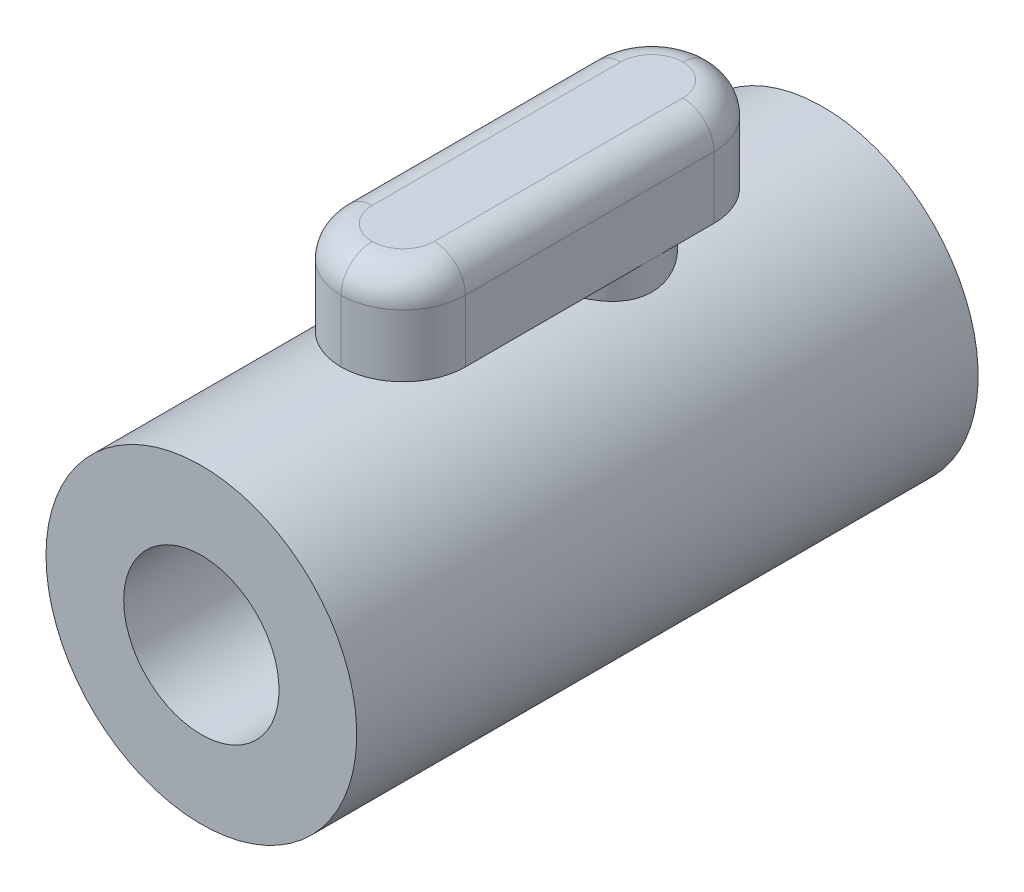
ISO-10303-21;
HEADER;
FILE_DESCRIPTION(('STEP AP214'),'2;1');
FILE_NAME('part.step','',(''),(''),'','','');
FILE_SCHEMA(('AUTOMOTIVE_DESIGN { 1 0 10303 214 1 1 1 1 }'));
ENDSEC;
DATA;
#1=APPLICATION_CONTEXT('core data for automotive mechanical design processes');
#2=APPLICATION_PROTOCOL_DEFINITION('international standard','automotive_design',2000,#1);
#3=PRODUCT_CONTEXT('',#1,'mechanical');
#4=PRODUCT('Part','Part','',(#3));
#5=PRODUCT_RELATED_PRODUCT_CATEGORY('part','',(#4));
#6=PRODUCT_DEFINITION_FORMATION('','',#4);
#7=PRODUCT_DEFINITION_CONTEXT('part definition',#1,'design');
#8=PRODUCT_DEFINITION('design','',#6,#7);
#9=PRODUCT_DEFINITION_SHAPE('','',#8);
#10=(LENGTH_UNIT() NAMED_UNIT(*) SI_UNIT(.MILLI.,.METRE.));
#11=(NAMED_UNIT(*) PLANE_ANGLE_UNIT() SI_UNIT($,.RADIAN.));
#12=(NAMED_UNIT(*) SI_UNIT($,.STERADIAN.) SOLID_ANGLE_UNIT());
#13=UNCERTAINTY_MEASURE_WITH_UNIT(LENGTH_MEASURE(1.E-05),#10,'distance_accuracy_value','');
#14=(GEOMETRIC_REPRESENTATION_CONTEXT(3) GLOBAL_UNCERTAINTY_ASSIGNED_CONTEXT((#13)) GLOBAL_UNIT_ASSIGNED_CONTEXT((#10,
#11,#12)) REPRESENTATION_CONTEXT('',''));
#15=CARTESIAN_POINT('',(0.,0.,0.));
#16=DIRECTION('',(0.,0.,1.));
#17=DIRECTION('',(1.,0.,0.));
#18=AXIS2_PLACEMENT_3D('',#15,#16,#17);
#19=CARTESIAN_POINT('',(0.,-10.002,-15.));
#20=DIRECTION('',(0.,1.,0.));
#21=DIRECTION('',(0.,0.,1.));
#22=AXIS2_PLACEMENT_3D('',#19,#20,#21);
#23=CYLINDRICAL_SURFACE('',#22,4.);
#24=CARTESIAN_POINT('',(0.,10.,-11.));
#25=CARTESIAN_POINT('',(0.107549581345536,9.99999886871264,-11.0000015749329));
#26=CARTESIAN_POINT('',(0.215132147940361,9.99825999367799,-11.0043436710802));
#27=CARTESIAN_POINT('',(0.429535200549548,9.99134740691108,-11.0216733827839));
#28=CARTESIAN_POINT('',(0.536355162703301,9.98617152790588,-11.0346664534026));
#29=CARTESIAN_POINT('',(0.748635856497416,9.97250573560117,-11.0692080345506));
#30=CARTESIAN_POINT('',(0.854093134440869,9.96400865312144,-11.0907750546198));
#31=CARTESIAN_POINT('',(1.0626676111401,9.94393017211574,-11.1422417304368));
#32=CARTESIAN_POINT('',(1.1657838422726,9.932347522545,-11.1721447662553));
#33=CARTESIAN_POINT('',(1.46979509681069,9.89349112162205,-11.273722808716));
#34=CARTESIAN_POINT('',(1.66629107461992,9.86204458846134,-11.3574218190064));
#35=CARTESIAN_POINT('',(2.04217417878102,9.79113035538708,-11.5540462173498));
#36=CARTESIAN_POINT('',(2.22156721456799,9.75166544086262,-11.6669614601149));
#37=CARTESIAN_POINT('',(2.56699339938209,9.66661825353092,-11.9244687545217));
#38=CARTESIAN_POINT('',(2.73212223266508,9.62084608086599,-12.0702127105756));
#39=CARTESIAN_POINT('',(3.03635232313263,9.52921139577231,-12.386800609152));
#40=CARTESIAN_POINT('',(3.17544084661153,9.48334885017047,-12.5576567590165));
#41=CARTESIAN_POINT('',(3.42974847409894,9.39445587657958,-12.9288559685663));
#42=CARTESIAN_POINT('',(3.54362978572887,9.35164233015934,-13.1301729260637));
#43=CARTESIAN_POINT('',(3.73550961465234,9.2766729328807,-13.5510728428009));
#44=CARTESIAN_POINT('',(3.81352517485723,9.24451202207146,-13.7706470677414));
#45=CARTESIAN_POINT('',(3.92779760260541,9.19652715590089,-14.2114246556858));
#46=CARTESIAN_POINT('',(3.96578791979826,9.18002840771385,-14.4321024680881));
#47=CARTESIAN_POINT('',(4.00434593508728,9.16328008038142,-14.8772699996773));
#48=CARTESIAN_POINT('',(4.00493203570086,9.16302251073202,-15.1017577900111));
#49=CARTESIAN_POINT('',(3.9699787321474,9.17821000534301,-15.5315133422232));
#50=CARTESIAN_POINT('',(3.93695062778272,9.19256349925666,-15.7370314287657));
#51=CARTESIAN_POINT('',(3.83989376129508,9.23352375055553,-16.1393191123503));
#52=CARTESIAN_POINT('',(3.77585958980135,9.26013264599921,-16.3360871763063));
#53=CARTESIAN_POINT('',(3.6173894649114,9.32318970221162,-16.7200356722919));
#54=CARTESIAN_POINT('',(3.52235972457939,9.35982758573424,-16.9069384780825));
#55=CARTESIAN_POINT('',(3.30501292151569,9.43876232767927,-17.26283163275));
#56=CARTESIAN_POINT('',(3.1826856102159,9.48106130910412,-17.4318152188131));
#57=CARTESIAN_POINT('',(2.90310119889356,9.57053473488081,-17.760819457596));
#58=CARTESIAN_POINT('',(2.74387492593716,9.61783329953252,-17.9191374588899));
#59=CARTESIAN_POINT('',(2.40062885486449,9.70919649915615,-18.2073689560062));
#60=CARTESIAN_POINT('',(2.21660413066998,9.75326048890393,-18.3372767948212));
#61=CARTESIAN_POINT('',(1.82415530521056,9.83429362529358,-18.5672348948311));
#62=CARTESIAN_POINT('',(1.61532098269266,9.87110540190899,-18.6666445623939));
#63=CARTESIAN_POINT('',(1.18204753096606,9.93229656657448,-18.8283357221563));
#64=CARTESIAN_POINT('',(0.957616393699399,9.95668226924746,-18.8906360751149));
#65=CARTESIAN_POINT('',(0.51379177521559,9.98912279013839,-18.9728965908394));
#66=CARTESIAN_POINT('',(0.29488658797114,9.99805891667034,-18.9951449085071));
#67=CARTESIAN_POINT('',(-0.143690619615706,10.0013695702126,-19.0034262010573));
#68=CARTESIAN_POINT('',(-0.363362426448183,9.99574787164577,-18.9894685630952));
#69=CARTESIAN_POINT('',(-0.786865478243654,9.97115134127512,-18.9274164948959));
#70=CARTESIAN_POINT('',(-0.99096498354976,9.95278782691064,-18.8808840392975));
#71=CARTESIAN_POINT('',(-1.38827085612275,9.90518882810983,-18.757128583381));
#72=CARTESIAN_POINT('',(-1.58147582045412,9.87595194712999,-18.6799016406648));
#73=CARTESIAN_POINT('',(-1.95815757162884,9.80833189541687,-18.4944301206379));
#74=CARTESIAN_POINT('',(-2.14115604549353,9.76969631959847,-18.3853090559053));
#75=CARTESIAN_POINT('',(-2.4868871825104,9.68746729490809,-18.1401193521971));
#76=CARTESIAN_POINT('',(-2.64961168158684,9.64387186219643,-18.0040399141861));
#77=CARTESIAN_POINT('',(-2.96144608598878,9.55290235277181,-17.6982599740674));
#78=CARTESIAN_POINT('',(-3.10894786734725,9.50546882853787,-17.5269329168592));
#79=CARTESIAN_POINT('',(-3.37350239509234,9.4148334583058,-17.1611198341097));
#80=CARTESIAN_POINT('',(-3.4905501236659,9.37163231039242,-16.9666299998006));
#81=CARTESIAN_POINT('',(-3.69161500286277,9.2942859982933,-16.5570766103267));
#82=CARTESIAN_POINT('',(-3.77530118531766,9.26023261821741,-16.3418319997565));
#83=CARTESIAN_POINT('',(-3.90459244315908,9.20647346903737,-15.8985326983872));
#84=CARTESIAN_POINT('',(-3.95022562452798,9.18675711197461,-15.6704875951582));
#85=CARTESIAN_POINT('',(-3.99943122157417,9.16543518780389,-15.225744190156));
#86=CARTESIAN_POINT('',(-4.0057941177721,9.16262842667612,-15.009410298105));
#87=CARTESIAN_POINT('',(-3.98360636538274,9.17229671415009,-14.5789103072789));
#88=CARTESIAN_POINT('',(-3.9550601501471,9.18476982225497,-14.3647439367175));
#89=CARTESIAN_POINT('',(-3.86614256488129,9.2225330048627,-13.9533355391097));
#90=CARTESIAN_POINT('',(-3.80707437387706,9.2472967218297,-13.7557591537789));
#91=CARTESIAN_POINT('',(-3.66001151041638,9.30647993934966,-13.3732430382103));
#92=CARTESIAN_POINT('',(-3.5720088493455,9.34090210615105,-13.1883068148887));
#93=CARTESIAN_POINT('',(-3.36374310804133,9.41797252826471,-12.8247795892905));
#94=CARTESIAN_POINT('',(-3.24192140926543,9.46097893410836,-12.6471581693117));
#95=CARTESIAN_POINT('',(-2.97179350239177,9.54927479921251,-12.3140178573752));
#96=CARTESIAN_POINT('',(-2.82347931168581,9.59456494363941,-12.15850565271));
#97=CARTESIAN_POINT('',(-2.492974124467,9.68587647140965,-11.8635764074694));
#98=CARTESIAN_POINT('',(-2.30921017071955,9.73175488236393,-11.7258566160177));
#99=CARTESIAN_POINT('',(-2.01716584575533,9.7949502762577,-11.5439518910625));
#100=CARTESIAN_POINT('',(-1.91699501972425,9.81509269692655,-11.487392936147));
#101=CARTESIAN_POINT('',(-1.7118011098248,9.85294835133019,-11.3829620045947));
#102=CARTESIAN_POINT('',(-1.60678027559742,9.87066269647665,-11.335086050192));
#103=CARTESIAN_POINT('',(-1.39454646904328,9.9028559935491,-11.249252015315));
#104=CARTESIAN_POINT('',(-1.28740777135872,9.91738778532477,-11.2111298452528));
#105=CARTESIAN_POINT('',(-1.06995577523383,9.94319722915714,-11.1440786522787));
#106=CARTESIAN_POINT('',(-0.959643983352617,9.95447639837582,-11.1151453426501));
#107=CARTESIAN_POINT('',(-0.736945215856834,9.97343330649399,-11.066825163851));
#108=CARTESIAN_POINT('',(-0.62456426359128,9.98112017494336,-11.047414088355));
#109=CARTESIAN_POINT('',(-0.398419132407603,9.99270031578293,-11.0182614293338));
#110=CARTESIAN_POINT('',(-0.284655994966353,9.99659628445551,-11.0085129731657));
#111=CARTESIAN_POINT('',(-0.113830463425493,9.99951445883957,-11.0012141044266));
#112=CARTESIAN_POINT('',(-0.0569198512645302,10.0000005987258,-10.9999991664779));
#113=CARTESIAN_POINT('',(0.,10.,-11.));
#114=B_SPLINE_CURVE_WITH_KNOTS('',3,(#24,#25,#26,#27,#28,#29,#30,#31,#32,#33,#34,#35,#36,#37,
#38,#39,#40,#41,#42,#43,#44,#45,#46,#47,#48,#49,#50,#51,#52,#53,#54,#55,#56,#57,#58,#59,#60,#61,
#62,#63,#64,#65,#66,#67,#68,#69,#70,#71,#72,#73,#74,#75,#76,#77,#78,#79,#80,#81,#82,#83,#84,#85,
#86,#87,#88,#89,#90,#91,#92,#93,#94,#95,#96,#97,#98,#99,#100,#101,#102,#103,#104,#105,#106,#107,
#108,#109,#110,#111,#112,#113),.UNSPECIFIED.,.T.,.F.,(4,2,2,2,2,2,2,2,2,2,2,2,2,2,2,2,2,2,2,2,2,
2,2,2,2,2,2,2,2,2,2,2,2,2,2,2,2,2,2,2,2,2,2,2,4),(0.,0.322603993422155,0.645411604786482,
0.968919914471235,1.29255959093095,1.93701523385824,2.58124739027476,3.25313995292302,
3.92536021760331,4.62749749529941,5.32930078128044,5.99927442509165,6.66891844572483,
7.29195888698823,7.9151080641227,8.55097484497808,9.18708075776542,9.87235930273289,
10.5577741757964,11.2567305822579,11.9553314412776,12.6125760095619,13.2696501904034,
13.8972014302891,14.5248332988777,15.171662586967,15.8187515089811,16.50856181149,
17.1984856998767,17.8950932218183,18.5911857719204,19.2371857868567,19.8831037702627,
20.5034786899771,21.124025035105,21.7801016801356,22.4363763459696,23.1352007896785,
23.4851924266232,23.8350233218042,24.1785111324565,24.52183846562,24.8642884495951,
25.2064946871486,25.3772305569977),.UNSPECIFIED.);
#115=CARTESIAN_POINT('',(0.,10.,-11.));
#116=VERTEX_POINT('',#115);
#117=EDGE_CURVE('E155',#116,#116,#114,.T.);
#118=ORIENTED_EDGE('',*,*,#117,.T.);
#119=EDGE_LOOP('',(#118));
#120=FACE_BOUND('',#119,.T.);
#121=CARTESIAN_POINT('',(0.,11.,-15.));
#122=DIRECTION('',(0.,1.,0.));
#123=DIRECTION('',(0.,0.,1.));
#124=AXIS2_PLACEMENT_3D('',#121,#122,#123);
#125=CIRCLE('',#124,4.);
#126=CARTESIAN_POINT('',(4.,11.,-15.));
#127=VERTEX_POINT('',#126);
#128=CARTESIAN_POINT('',(-4.,11.,-15.));
#129=VERTEX_POINT('',#128);
#130=EDGE_CURVE('E140',#127,#129,#125,.F.);
#131=ORIENTED_EDGE('',*,*,#130,.T.);
#132=CARTESIAN_POINT('',(0.,11.,-15.));
#133=DIRECTION('',(0.,1.,0.));
#134=DIRECTION('',(0.,0.,1.));
#135=AXIS2_PLACEMENT_3D('',#132,#133,#134);
#136=CIRCLE('',#135,4.);
#137=EDGE_CURVE('E131',#129,#127,#136,.F.);
#138=ORIENTED_EDGE('',*,*,#137,.T.);
#139=EDGE_LOOP('',(#131,#138));
#140=FACE_BOUND('',#139,.T.);
#141=ADVANCED_FACE('F47',(#120,#140),#23,.T.);
#142=CARTESIAN_POINT('',(0.,0.,-30.));
#143=DIRECTION('',(0.,0.,-1.));
#144=DIRECTION('',(-1.,0.,0.));
#145=AXIS2_PLACEMENT_3D('',#142,#143,#144);
#146=PLANE('',#145);
#147=CARTESIAN_POINT('',(0.,0.,-30.));
#148=DIRECTION('',(0.,0.,-1.));
#149=DIRECTION('',(-1.,0.,0.));
#150=AXIS2_PLACEMENT_3D('',#147,#148,#149);
#151=CIRCLE('',#150,10.);
#152=CARTESIAN_POINT('',(-10.,0.,-30.));
#153=VERTEX_POINT('',#152);
#154=EDGE_CURVE('E147',#153,#153,#151,.T.);
#155=ORIENTED_EDGE('',*,*,#154,.T.);
#156=EDGE_LOOP('',(#155));
#157=FACE_BOUND('',#156,.T.);
#158=CARTESIAN_POINT('',(0.,0.,-30.));
#159=DIRECTION('',(0.,0.,-1.));
#160=DIRECTION('',(-1.,0.,0.));
#161=AXIS2_PLACEMENT_3D('',#158,#159,#160);
#162=CIRCLE('',#161,5.);
#163=CARTESIAN_POINT('',(-5.,0.,-30.));
#164=VERTEX_POINT('',#163);
#165=EDGE_CURVE('E170',#164,#164,#162,.T.);
#166=ORIENTED_EDGE('',*,*,#165,.F.);
#167=EDGE_LOOP('',(#166));
#168=FACE_BOUND('',#167,.T.);
#169=ADVANCED_FACE('F194',(#157,#168),#146,.T.);
#170=CARTESIAN_POINT('',(0.,0.,10.));
#171=DIRECTION('',(0.,0.,-1.));
#172=DIRECTION('',(-1.,0.,0.));
#173=AXIS2_PLACEMENT_3D('',#170,#171,#172);
#174=PLANE('',#173);
#175=CARTESIAN_POINT('',(0.,0.,10.));
#176=DIRECTION('',(0.,0.,-1.));
#177=DIRECTION('',(-1.,0.,0.));
#178=AXIS2_PLACEMENT_3D('',#175,#176,#177);
#179=CIRCLE('',#178,10.);
#180=CARTESIAN_POINT('',(-10.,0.,10.));
#181=VERTEX_POINT('',#180);
#182=EDGE_CURVE('E214',#181,#181,#179,.T.);
#183=ORIENTED_EDGE('',*,*,#182,.F.);
#184=EDGE_LOOP('',(#183));
#185=FACE_BOUND('',#184,.T.);
#186=CARTESIAN_POINT('',(0.,0.,10.));
#187=DIRECTION('',(0.,0.,-1.));
#188=DIRECTION('',(-1.,0.,0.));
#189=AXIS2_PLACEMENT_3D('',#186,#187,#188);
#190=CIRCLE('',#189,5.);
#191=CARTESIAN_POINT('',(-5.,0.,10.));
#192=VERTEX_POINT('',#191);
#193=EDGE_CURVE('E169',#192,#192,#190,.T.);
#194=ORIENTED_EDGE('',*,*,#193,.T.);
#195=EDGE_LOOP('',(#194));
#196=FACE_BOUND('',#195,.T.);
#197=ADVANCED_FACE('F199',(#185,#196),#174,.F.);
#198=CARTESIAN_POINT('',(0.,0.,-30.));
#199=DIRECTION('',(0.,0.,1.));
#200=DIRECTION('',(1.,0.,0.));
#201=AXIS2_PLACEMENT_3D('',#198,#199,#200);
#202=CYLINDRICAL_SURFACE('',#201,10.);
#203=ORIENTED_EDGE('',*,*,#117,.F.);
#204=EDGE_LOOP('',(#203));
#205=FACE_BOUND('',#204,.T.);
#206=ORIENTED_EDGE('',*,*,#154,.F.);
#207=EDGE_LOOP('',(#206));
#208=FACE_BOUND('',#207,.T.);
#209=ORIENTED_EDGE('',*,*,#182,.T.);
#210=EDGE_LOOP('',(#209));
#211=FACE_BOUND('',#210,.T.);
#212=ADVANCED_FACE('F204',(#205,#208,#211),#202,.T.);
#213=CARTESIAN_POINT('',(0.,0.,-30.));
#214=DIRECTION('',(0.,0.,1.));
#215=DIRECTION('',(1.,0.,0.));
#216=AXIS2_PLACEMENT_3D('',#213,#214,#215);
#217=CYLINDRICAL_SURFACE('',#216,5.);
#218=ORIENTED_EDGE('',*,*,#165,.T.);
#219=EDGE_LOOP('',(#218));
#220=FACE_BOUND('',#219,.T.);
#221=ORIENTED_EDGE('',*,*,#193,.F.);
#222=EDGE_LOOP('',(#221));
#223=FACE_BOUND('',#222,.T.);
#224=ADVANCED_FACE('F207',(#220,#223),#217,.F.);
#225=CARTESIAN_POINT('',(4.,11.,-22.9909668658333));
#226=DIRECTION('',(0.,1.,0.));
#227=DIRECTION('',(0.,0.,1.));
#228=AXIS2_PLACEMENT_3D('',#225,#226,#227);
#229=PLANE('',#228);
#230=CARTESIAN_POINT('',(0.,11.,-2.9909668658333));
#231=DIRECTION('',(0.,1.,0.));
#232=DIRECTION('',(0.,0.,1.));
#233=AXIS2_PLACEMENT_3D('',#230,#231,#232);
#234=CIRCLE('',#233,4.);
#235=CARTESIAN_POINT('',(4.,11.,-2.9909668658333));
#236=VERTEX_POINT('',#235);
#237=CARTESIAN_POINT('',(0.,11.,1.0090331341667));
#238=VERTEX_POINT('',#237);
#239=EDGE_CURVE('E223',#236,#238,#234,.F.);
#240=ORIENTED_EDGE('',*,*,#239,.T.);
#241=CARTESIAN_POINT('',(0.,11.,-2.9909668658333));
#242=DIRECTION('',(0.,1.,0.));
#243=DIRECTION('',(0.,0.,1.));
#244=AXIS2_PLACEMENT_3D('',#241,#242,#243);
#245=CIRCLE('',#244,4.);
#246=CARTESIAN_POINT('',(-4.,11.,-2.9909668658333));
#247=VERTEX_POINT('',#246);
#248=EDGE_CURVE('E225',#238,#247,#245,.F.);
#249=ORIENTED_EDGE('',*,*,#248,.T.);
#250=DIRECTION('',(0.,0.,1.));
#251=VECTOR('',#250,1.);
#252=CARTESIAN_POINT('',(-4.,11.,-22.9909668658333));
#253=LINE('',#252,#251);
#254=EDGE_CURVE('E154',#129,#247,#253,.T.);
#255=ORIENTED_EDGE('',*,*,#254,.F.);
#256=ORIENTED_EDGE('',*,*,#130,.F.);
#257=DIRECTION('',(0.,0.,1.));
#258=VECTOR('',#257,1.);
#259=CARTESIAN_POINT('',(4.,11.,-22.9909668658333));
#260=LINE('',#259,#258);
#261=EDGE_CURVE('E141',#127,#236,#260,.T.);
#262=ORIENTED_EDGE('',*,*,#261,.T.);
#263=EDGE_LOOP('',(#240,#249,#255,#256,#262));
#264=FACE_BOUND('',#263,.T.);
#265=ADVANCED_FACE('F151',(#264),#229,.F.);
#266=CARTESIAN_POINT('',(4.,11.,-22.9909668658333));
#267=DIRECTION('',(-1.,0.,0.));
#268=DIRECTION('',(0.,0.,1.));
#269=AXIS2_PLACEMENT_3D('',#266,#267,#268);
#270=PLANE('',#269);
#271=DIRECTION('',(0.,-1.,0.));
#272=VECTOR('',#271,1.);
#273=CARTESIAN_POINT('',(4.,11.,-18.9909668658333));
#274=LINE('',#273,#272);
#275=CARTESIAN_POINT('',(4.,11.,-18.9909668658333));
#276=VERTEX_POINT('',#275);
#277=CARTESIAN_POINT('',(4.,15.,-18.9909668658333));
#278=VERTEX_POINT('',#277);
#279=EDGE_CURVE('E227',#276,#278,#274,.F.);
#280=ORIENTED_EDGE('',*,*,#279,.T.);
#281=DIRECTION('',(0.,0.,1.));
#282=VECTOR('',#281,1.);
#283=CARTESIAN_POINT('',(4.,15.,-22.9909668658333));
#284=LINE('',#283,#282);
#285=CARTESIAN_POINT('',(4.,15.,-2.9909668658333));
#286=VERTEX_POINT('',#285);
#287=EDGE_CURVE('E255',#278,#286,#284,.T.);
#288=ORIENTED_EDGE('',*,*,#287,.T.);
#289=DIRECTION('',(0.,-1.,0.));
#290=VECTOR('',#289,1.);
#291=CARTESIAN_POINT('',(4.,11.,-2.9909668658333));
#292=LINE('',#291,#290);
#293=EDGE_CURVE('E158',#286,#236,#292,.T.);
#294=ORIENTED_EDGE('',*,*,#293,.T.);
#295=ORIENTED_EDGE('',*,*,#261,.F.);
#296=EDGE_CURVE('E127',#276,#127,#260,.T.);
#297=ORIENTED_EDGE('',*,*,#296,.F.);
#298=EDGE_LOOP('',(#280,#288,#294,#295,#297));
#299=FACE_BOUND('',#298,.T.);
#300=ADVANCED_FACE('F157',(#299),#270,.F.);
#301=CARTESIAN_POINT('',(-4.,11.,-18.9909668658333));
#302=VERTEX_POINT('',#301);
#303=EDGE_CURVE('E159',#302,#129,#253,.T.);
#304=ORIENTED_EDGE('',*,*,#303,.F.);
#305=CARTESIAN_POINT('',(0.,11.,-18.9909668658333));
#306=DIRECTION('',(0.,1.,0.));
#307=DIRECTION('',(0.,0.,1.));
#308=AXIS2_PLACEMENT_3D('',#305,#306,#307);
#309=CIRCLE('',#308,4.);
#310=CARTESIAN_POINT('',(0.,11.,-22.9909668658333));
#311=VERTEX_POINT('',#310);
#312=EDGE_CURVE('E231',#302,#311,#309,.F.);
#313=ORIENTED_EDGE('',*,*,#312,.T.);
#314=CARTESIAN_POINT('',(0.,11.,-18.9909668658333));
#315=DIRECTION('',(0.,1.,0.));
#316=DIRECTION('',(0.,0.,1.));
#317=AXIS2_PLACEMENT_3D('',#314,#315,#316);
#318=CIRCLE('',#317,4.);
#319=EDGE_CURVE('E135',#311,#276,#318,.F.);
#320=ORIENTED_EDGE('',*,*,#319,.T.);
#321=ORIENTED_EDGE('',*,*,#296,.T.);
#322=ORIENTED_EDGE('',*,*,#137,.F.);
#323=EDGE_LOOP('',(#304,#313,#320,#321,#322));
#324=FACE_BOUND('',#323,.T.);
#325=ADVANCED_FACE('F130',(#324),#229,.F.);
#326=CARTESIAN_POINT('',(-4.,11.,-22.9909668658333));
#327=DIRECTION('',(1.,0.,0.));
#328=DIRECTION('',(0.,0.,-1.));
#329=AXIS2_PLACEMENT_3D('',#326,#327,#328);
#330=PLANE('',#329);
#331=DIRECTION('',(0.,1.,0.));
#332=VECTOR('',#331,1.);
#333=CARTESIAN_POINT('',(-4.,17.,-2.9909668658333));
#334=LINE('',#333,#332);
#335=CARTESIAN_POINT('',(-4.,15.,-2.9909668658333));
#336=VERTEX_POINT('',#335);
#337=EDGE_CURVE('E221',#247,#336,#334,.T.);
#338=ORIENTED_EDGE('',*,*,#337,.T.);
#339=DIRECTION('',(0.,0.,1.));
#340=VECTOR('',#339,1.);
#341=CARTESIAN_POINT('',(-4.,15.,-22.9909668658333));
#342=LINE('',#341,#340);
#343=CARTESIAN_POINT('',(-4.,15.,-18.9909668658333));
#344=VERTEX_POINT('',#343);
#345=EDGE_CURVE('E12',#336,#344,#342,.F.);
#346=ORIENTED_EDGE('',*,*,#345,.T.);
#347=DIRECTION('',(0.,1.,0.));
#348=VECTOR('',#347,1.);
#349=CARTESIAN_POINT('',(-4.,11.,-18.9909668658333));
#350=LINE('',#349,#348);
#351=EDGE_CURVE('E146',#344,#302,#350,.F.);
#352=ORIENTED_EDGE('',*,*,#351,.T.);
#353=ORIENTED_EDGE('',*,*,#303,.T.);
#354=ORIENTED_EDGE('',*,*,#254,.T.);
#355=EDGE_LOOP('',(#338,#346,#352,#353,#354));
#356=FACE_BOUND('',#355,.T.);
#357=ADVANCED_FACE('F180',(#356),#330,.F.);
#358=CARTESIAN_POINT('',(4.,17.,-22.9909668658333));
#359=DIRECTION('',(0.,-1.,0.));
#360=DIRECTION('',(0.,0.,-1.));
#361=AXIS2_PLACEMENT_3D('',#358,#359,#360);
#362=PLANE('',#361);
#363=CARTESIAN_POINT('',(0.,17.,-18.9909668658333));
#364=DIRECTION('',(0.,-1.,0.));
#365=DIRECTION('',(0.,0.,-1.));
#366=AXIS2_PLACEMENT_3D('',#363,#364,#365);
#367=CIRCLE('',#366,2.);
#368=CARTESIAN_POINT('',(2.,17.,-18.9909668658333));
#369=VERTEX_POINT('',#368);
#370=CARTESIAN_POINT('',(0.,17.,-20.9909668658333));
#371=VERTEX_POINT('',#370);
#372=EDGE_CURVE('E245',#369,#371,#367,.F.);
#373=ORIENTED_EDGE('',*,*,#372,.T.);
#374=CARTESIAN_POINT('',(0.,17.,-18.9909668658333));
#375=DIRECTION('',(0.,-1.,0.));
#376=DIRECTION('',(0.,0.,-1.));
#377=AXIS2_PLACEMENT_3D('',#374,#375,#376);
#378=CIRCLE('',#377,2.);
#379=CARTESIAN_POINT('',(-2.,17.,-18.9909668658333));
#380=VERTEX_POINT('',#379);
#381=EDGE_CURVE('E247',#371,#380,#378,.F.);
#382=ORIENTED_EDGE('',*,*,#381,.T.);
#383=DIRECTION('',(0.,0.,1.));
#384=VECTOR('',#383,1.);
#385=CARTESIAN_POINT('',(-2.,17.,-22.9909668658333));
#386=LINE('',#385,#384);
#387=CARTESIAN_POINT('',(-2.,17.,-2.9909668658333));
#388=VERTEX_POINT('',#387);
#389=EDGE_CURVE('E233',#380,#388,#386,.T.);
#390=ORIENTED_EDGE('',*,*,#389,.T.);
#391=CARTESIAN_POINT('',(0.,17.,-2.9909668658333));
#392=DIRECTION('',(0.,-1.,0.));
#393=DIRECTION('',(0.,0.,-1.));
#394=AXIS2_PLACEMENT_3D('',#391,#392,#393);
#395=CIRCLE('',#394,2.);
#396=CARTESIAN_POINT('',(0.,17.,-0.990966865833299));
#397=VERTEX_POINT('',#396);
#398=EDGE_CURVE('E239',#388,#397,#395,.F.);
#399=ORIENTED_EDGE('',*,*,#398,.T.);
#400=CARTESIAN_POINT('',(0.,17.,-2.9909668658333));
#401=DIRECTION('',(0.,-1.,0.));
#402=DIRECTION('',(0.,0.,-1.));
#403=AXIS2_PLACEMENT_3D('',#400,#401,#402);
#404=CIRCLE('',#403,2.);
#405=CARTESIAN_POINT('',(2.,17.,-2.9909668658333));
#406=VERTEX_POINT('',#405);
#407=EDGE_CURVE('E241',#397,#406,#404,.F.);
#408=ORIENTED_EDGE('',*,*,#407,.T.);
#409=DIRECTION('',(0.,0.,1.));
#410=VECTOR('',#409,1.);
#411=CARTESIAN_POINT('',(2.,17.,-22.9909668658333));
#412=LINE('',#411,#410);
#413=EDGE_CURVE('E243',#406,#369,#412,.F.);
#414=ORIENTED_EDGE('',*,*,#413,.T.);
#415=EDGE_LOOP('',(#373,#382,#390,#399,#408,#414));
#416=FACE_BOUND('',#415,.T.);
#417=ADVANCED_FACE('F183',(#416),#362,.F.);
#418=CARTESIAN_POINT('',(0.,11.,-2.9909668658333));
#419=DIRECTION('',(0.,1.,0.));
#420=DIRECTION('',(0.,0.,1.));
#421=AXIS2_PLACEMENT_3D('',#418,#419,#420);
#422=CYLINDRICAL_SURFACE('',#421,4.);
#423=ORIENTED_EDGE('',*,*,#293,.F.);
#424=CARTESIAN_POINT('',(0.,15.,-2.9909668658333));
#425=DIRECTION('',(0.,-1.,0.));
#426=DIRECTION('',(0.,0.,-1.));
#427=AXIS2_PLACEMENT_3D('',#424,#425,#426);
#428=CIRCLE('',#427,4.);
#429=CARTESIAN_POINT('',(0.,15.,1.0090331341667));
#430=VERTEX_POINT('',#429);
#431=EDGE_CURVE('E71',#286,#430,#428,.T.);
#432=ORIENTED_EDGE('',*,*,#431,.T.);
#433=DIRECTION('',(0.,-1.,0.));
#434=VECTOR('',#433,1.);
#435=CARTESIAN_POINT('',(0.,17.,1.0090331341667));
#436=LINE('',#435,#434);
#437=EDGE_CURVE('E234',#238,#430,#436,.F.);
#438=ORIENTED_EDGE('',*,*,#437,.F.);
#439=ORIENTED_EDGE('',*,*,#239,.F.);
#440=EDGE_LOOP('',(#423,#432,#438,#439));
#441=FACE_BOUND('',#440,.T.);
#442=ADVANCED_FACE('F186',(#441),#422,.T.);
#443=CARTESIAN_POINT('',(0.,11.,-2.9909668658333));
#444=DIRECTION('',(0.,-1.,0.));
#445=DIRECTION('',(0.,0.,-1.));
#446=AXIS2_PLACEMENT_3D('',#443,#444,#445);
#447=CYLINDRICAL_SURFACE('',#446,4.);
#448=ORIENTED_EDGE('',*,*,#437,.T.);
#449=CARTESIAN_POINT('',(0.,15.,-2.9909668658333));
#450=DIRECTION('',(0.,-1.,0.));
#451=DIRECTION('',(0.,0.,-1.));
#452=AXIS2_PLACEMENT_3D('',#449,#450,#451);
#453=CIRCLE('',#452,4.);
#454=EDGE_CURVE('E56',#430,#336,#453,.T.);
#455=ORIENTED_EDGE('',*,*,#454,.T.);
#456=ORIENTED_EDGE('',*,*,#337,.F.);
#457=ORIENTED_EDGE('',*,*,#248,.F.);
#458=EDGE_LOOP('',(#448,#455,#456,#457));
#459=FACE_BOUND('',#458,.T.);
#460=ADVANCED_FACE('F191',(#459),#447,.T.);
#461=CARTESIAN_POINT('',(0.,0.,-18.9909668658333));
#462=DIRECTION('',(0.,-1.,0.));
#463=DIRECTION('',(0.,0.,-1.));
#464=AXIS2_PLACEMENT_3D('',#461,#462,#463);
#465=CYLINDRICAL_SURFACE('',#464,4.);
#466=DIRECTION('',(0.,-1.,0.));
#467=VECTOR('',#466,1.);
#468=CARTESIAN_POINT('',(0.,0.,-22.9909668658333));
#469=LINE('',#468,#467);
#470=CARTESIAN_POINT('',(0.,15.,-22.9909668658333));
#471=VERTEX_POINT('',#470);
#472=EDGE_CURVE('E236',#471,#311,#469,.T.);
#473=ORIENTED_EDGE('',*,*,#472,.F.);
#474=CARTESIAN_POINT('',(0.,15.,-18.9909668658333));
#475=DIRECTION('',(0.,-1.,0.));
#476=DIRECTION('',(0.,0.,-1.));
#477=AXIS2_PLACEMENT_3D('',#474,#475,#476);
#478=CIRCLE('',#477,4.);
#479=EDGE_CURVE('E253',#471,#278,#478,.T.);
#480=ORIENTED_EDGE('',*,*,#479,.T.);
#481=ORIENTED_EDGE('',*,*,#279,.F.);
#482=ORIENTED_EDGE('',*,*,#319,.F.);
#483=EDGE_LOOP('',(#473,#480,#481,#482));
#484=FACE_BOUND('',#483,.T.);
#485=ADVANCED_FACE('F304',(#484),#465,.T.);
#486=CARTESIAN_POINT('',(0.,0.,-18.9909668658333));
#487=DIRECTION('',(0.,1.,0.));
#488=DIRECTION('',(0.,0.,1.));
#489=AXIS2_PLACEMENT_3D('',#486,#487,#488);
#490=CYLINDRICAL_SURFACE('',#489,4.);
#491=ORIENTED_EDGE('',*,*,#351,.F.);
#492=CARTESIAN_POINT('',(0.,15.,-18.9909668658333));
#493=DIRECTION('',(0.,-1.,0.));
#494=DIRECTION('',(0.,0.,-1.));
#495=AXIS2_PLACEMENT_3D('',#492,#493,#494);
#496=CIRCLE('',#495,4.);
#497=EDGE_CURVE('E250',#344,#471,#496,.T.);
#498=ORIENTED_EDGE('',*,*,#497,.T.);
#499=ORIENTED_EDGE('',*,*,#472,.T.);
#500=ORIENTED_EDGE('',*,*,#312,.F.);
#501=EDGE_LOOP('',(#491,#498,#499,#500));
#502=FACE_BOUND('',#501,.T.);
#503=ADVANCED_FACE('F293',(#502),#490,.T.);
#504=CARTESIAN_POINT('',(0.,15.,-2.9909668658333));
#505=DIRECTION('',(0.,-1.,0.));
#506=DIRECTION('',(0.,0.,-1.));
#507=AXIS2_PLACEMENT_3D('',#504,#505,#506);
#508=DEGENERATE_TOROIDAL_SURFACE('',#507,2.,2.,.T.);
#509=CARTESIAN_POINT('',(0.,15.,-0.990966865833299));
#510=DIRECTION('',(-1.,0.,0.));
#511=DIRECTION('',(0.,0.,1.));
#512=AXIS2_PLACEMENT_3D('',#509,#510,#511);
#513=CIRCLE('',#512,2.);
#514=EDGE_CURVE('E268',#430,#397,#513,.T.);
#515=ORIENTED_EDGE('',*,*,#514,.F.);
#516=ORIENTED_EDGE('',*,*,#431,.F.);
#517=CARTESIAN_POINT('',(2.,15.,-2.9909668658333));
#518=DIRECTION('',(0.,0.,-1.));
#519=DIRECTION('',(-1.,0.,0.));
#520=AXIS2_PLACEMENT_3D('',#517,#518,#519);
#521=CIRCLE('',#520,2.);
#522=EDGE_CURVE('E51',#406,#286,#521,.T.);
#523=ORIENTED_EDGE('',*,*,#522,.F.);
#524=ORIENTED_EDGE('',*,*,#407,.F.);
#525=EDGE_LOOP('',(#515,#516,#523,#524));
#526=FACE_BOUND('',#525,.T.);
#527=ADVANCED_FACE('F49',(#526),#508,.T.);
#528=CARTESIAN_POINT('',(2.,15.,-22.9909668658333));
#529=DIRECTION('',(0.,0.,1.));
#530=DIRECTION('',(1.,0.,0.));
#531=AXIS2_PLACEMENT_3D('',#528,#529,#530);
#532=CYLINDRICAL_SURFACE('',#531,2.);
#533=ORIENTED_EDGE('',*,*,#522,.T.);
#534=ORIENTED_EDGE('',*,*,#287,.F.);
#535=CARTESIAN_POINT('',(2.,15.,-18.9909668658333));
#536=DIRECTION('',(0.,0.,-1.));
#537=DIRECTION('',(-1.,0.,0.));
#538=AXIS2_PLACEMENT_3D('',#535,#536,#537);
#539=CIRCLE('',#538,2.);
#540=EDGE_CURVE('E266',#369,#278,#539,.T.);
#541=ORIENTED_EDGE('',*,*,#540,.F.);
#542=ORIENTED_EDGE('',*,*,#413,.F.);
#543=EDGE_LOOP('',(#533,#534,#541,#542));
#544=FACE_BOUND('',#543,.T.);
#545=ADVANCED_FACE('F278',(#544),#532,.T.);
#546=CARTESIAN_POINT('',(0.,15.,-2.9909668658333));
#547=DIRECTION('',(0.,-1.,0.));
#548=DIRECTION('',(0.,0.,-1.));
#549=AXIS2_PLACEMENT_3D('',#546,#547,#548);
#550=DEGENERATE_TOROIDAL_SURFACE('',#549,2.,2.,.T.);
#551=ORIENTED_EDGE('',*,*,#514,.T.);
#552=ORIENTED_EDGE('',*,*,#398,.F.);
#553=CARTESIAN_POINT('',(-2.,15.,-2.9909668658333));
#554=DIRECTION('',(0.,0.,-1.));
#555=DIRECTION('',(-1.,0.,0.));
#556=AXIS2_PLACEMENT_3D('',#553,#554,#555);
#557=CIRCLE('',#556,2.);
#558=EDGE_CURVE('E263',#336,#388,#557,.T.);
#559=ORIENTED_EDGE('',*,*,#558,.F.);
#560=ORIENTED_EDGE('',*,*,#454,.F.);
#561=EDGE_LOOP('',(#551,#552,#559,#560));
#562=FACE_BOUND('',#561,.T.);
#563=ADVANCED_FACE('F283',(#562),#550,.T.);
#564=CARTESIAN_POINT('',(0.,15.,-18.9909668658333));
#565=DIRECTION('',(0.,-1.,0.));
#566=DIRECTION('',(0.,0.,-1.));
#567=AXIS2_PLACEMENT_3D('',#564,#565,#566);
#568=DEGENERATE_TOROIDAL_SURFACE('',#567,2.,2.,.T.);
#569=ORIENTED_EDGE('',*,*,#540,.T.);
#570=ORIENTED_EDGE('',*,*,#479,.F.);
#571=CARTESIAN_POINT('',(0.,15.,-20.9909668658333));
#572=DIRECTION('',(-1.,0.,0.));
#573=DIRECTION('',(0.,0.,1.));
#574=AXIS2_PLACEMENT_3D('',#571,#572,#573);
#575=CIRCLE('',#574,2.);
#576=EDGE_CURVE('E261',#371,#471,#575,.T.);
#577=ORIENTED_EDGE('',*,*,#576,.F.);
#578=ORIENTED_EDGE('',*,*,#372,.F.);
#579=EDGE_LOOP('',(#569,#570,#577,#578));
#580=FACE_BOUND('',#579,.T.);
#581=ADVANCED_FACE('F302',(#580),#568,.T.);
#582=CARTESIAN_POINT('',(-2.,15.,-22.9909668658333));
#583=DIRECTION('',(0.,0.,1.));
#584=DIRECTION('',(1.,0.,0.));
#585=AXIS2_PLACEMENT_3D('',#582,#583,#584);
#586=CYLINDRICAL_SURFACE('',#585,2.);
#587=ORIENTED_EDGE('',*,*,#558,.T.);
#588=ORIENTED_EDGE('',*,*,#389,.F.);
#589=CARTESIAN_POINT('',(-2.,15.,-18.9909668658333));
#590=DIRECTION('',(0.,0.,-1.));
#591=DIRECTION('',(-1.,0.,0.));
#592=AXIS2_PLACEMENT_3D('',#589,#590,#591);
#593=CIRCLE('',#592,2.);
#594=EDGE_CURVE('E259',#344,#380,#593,.T.);
#595=ORIENTED_EDGE('',*,*,#594,.F.);
#596=ORIENTED_EDGE('',*,*,#345,.F.);
#597=EDGE_LOOP('',(#587,#588,#595,#596));
#598=FACE_BOUND('',#597,.T.);
#599=ADVANCED_FACE('F288',(#598),#586,.T.);
#600=CARTESIAN_POINT('',(0.,15.,-18.9909668658333));
#601=DIRECTION('',(0.,-1.,0.));
#602=DIRECTION('',(0.,0.,-1.));
#603=AXIS2_PLACEMENT_3D('',#600,#601,#602);
#604=DEGENERATE_TOROIDAL_SURFACE('',#603,2.,2.,.T.);
#605=ORIENTED_EDGE('',*,*,#576,.T.);
#606=ORIENTED_EDGE('',*,*,#497,.F.);
#607=ORIENTED_EDGE('',*,*,#594,.T.);
#608=ORIENTED_EDGE('',*,*,#381,.F.);
#609=EDGE_LOOP('',(#605,#606,#607,#608));
#610=FACE_BOUND('',#609,.T.);
#611=ADVANCED_FACE('F296',(#610),#604,.T.);
#612=CLOSED_SHELL('',(#141,#169,#197,#212,#224,#265,#300,#325,#357,#417,#442,#460,#485,#503,
#527,#545,#563,#581,#599,#611));
#613=MANIFOLD_SOLID_BREP('B2',#612);
#614=ADVANCED_BREP_SHAPE_REPRESENTATION('',(#18,#613),#14);
#615=SHAPE_DEFINITION_REPRESENTATION(#9,#614);
ENDSEC;
END-ISO-10303-21;
